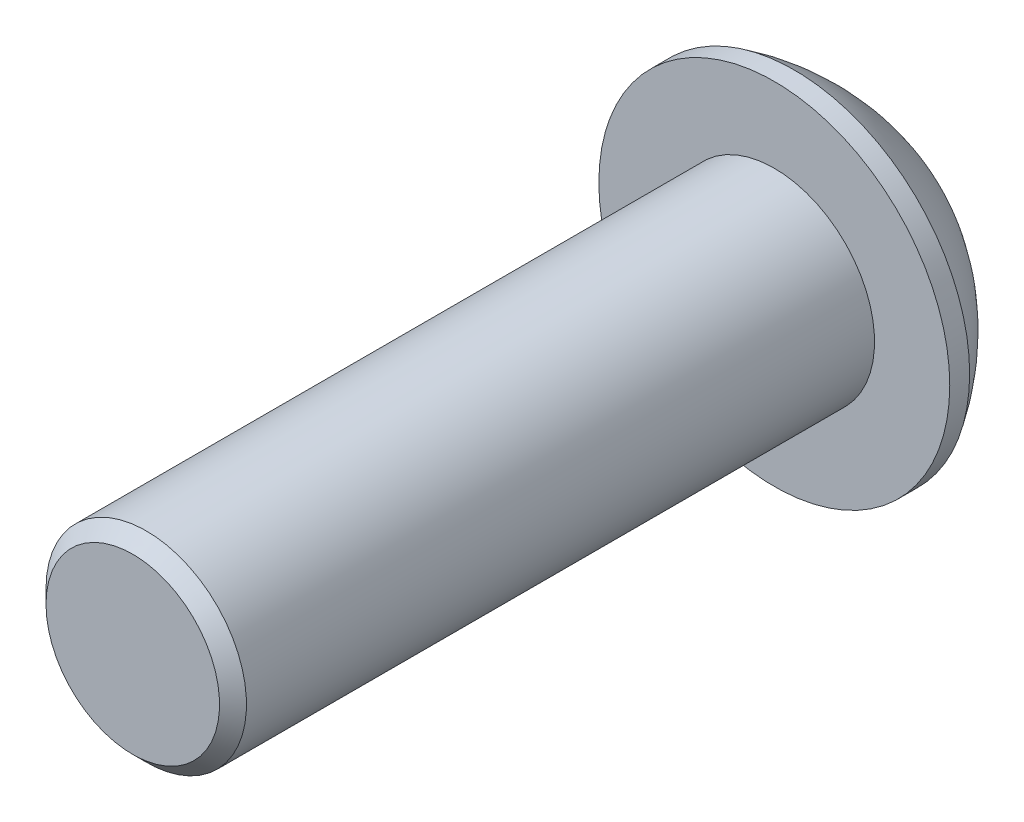
ISO-10303-21;
HEADER;
FILE_DESCRIPTION(('STEP AP214'),'2;1');
FILE_NAME('part.step','',(''),(''),'','','');
FILE_SCHEMA(('AUTOMOTIVE_DESIGN { 1 0 10303 214 1 1 1 1 }'));
ENDSEC;
DATA;
#1=APPLICATION_CONTEXT('core data for automotive mechanical design processes');
#2=APPLICATION_PROTOCOL_DEFINITION('international standard','automotive_design',2000,#1);
#3=PRODUCT_CONTEXT('',#1,'mechanical');
#4=PRODUCT('Part','Part','',(#3));
#5=PRODUCT_RELATED_PRODUCT_CATEGORY('part','',(#4));
#6=PRODUCT_DEFINITION_FORMATION('','',#4);
#7=PRODUCT_DEFINITION_CONTEXT('part definition',#1,'design');
#8=PRODUCT_DEFINITION('design','',#6,#7);
#9=PRODUCT_DEFINITION_SHAPE('','',#8);
#10=(LENGTH_UNIT() NAMED_UNIT(*) SI_UNIT(.MILLI.,.METRE.));
#11=(NAMED_UNIT(*) PLANE_ANGLE_UNIT() SI_UNIT($,.RADIAN.));
#12=(NAMED_UNIT(*) SI_UNIT($,.STERADIAN.) SOLID_ANGLE_UNIT());
#13=UNCERTAINTY_MEASURE_WITH_UNIT(LENGTH_MEASURE(1.E-05),#10,'distance_accuracy_value','');
#14=(GEOMETRIC_REPRESENTATION_CONTEXT(3) GLOBAL_UNCERTAINTY_ASSIGNED_CONTEXT((#13)) GLOBAL_UNIT_ASSIGNED_CONTEXT((#10,
#11,#12)) REPRESENTATION_CONTEXT('',''));
#15=CARTESIAN_POINT('',(0.,0.,0.));
#16=DIRECTION('',(0.,0.,1.));
#17=DIRECTION('',(1.,0.,0.));
#18=AXIS2_PLACEMENT_3D('',#15,#16,#17);
#19=CARTESIAN_POINT('',(3.175,0.,-4.2164));
#20=DIRECTION('',(0.,0.,1.));
#21=DIRECTION('',(1.,0.,0.));
#22=AXIS2_PLACEMENT_3D('',#19,#20,#21);
#23=PLANE('',#22);
#24=DIRECTION('',(0.5,0.866025403784439,0.));
#25=VECTOR('',#24,1.);
#26=CARTESIAN_POINT('',(-2.74963065701559,0.,-4.2164));
#27=LINE('',#26,#25);
#28=CARTESIAN_POINT('',(-2.74963065701559,0.,-4.2164));
#29=VERTEX_POINT('',#28);
#30=CARTESIAN_POINT('',(-1.3748153285078,2.38125,-4.2164));
#31=VERTEX_POINT('',#30);
#32=EDGE_CURVE('E126',#29,#31,#27,.T.);
#33=ORIENTED_EDGE('',*,*,#32,.F.);
#34=DIRECTION('',(-0.5,0.866025403784439,0.));
#35=VECTOR('',#34,1.);
#36=CARTESIAN_POINT('',(-1.3748153285078,-2.38125,-4.2164));
#37=LINE('',#36,#35);
#38=CARTESIAN_POINT('',(-1.3748153285078,-2.38125,-4.2164));
#39=VERTEX_POINT('',#38);
#40=EDGE_CURVE('E52',#39,#29,#37,.T.);
#41=ORIENTED_EDGE('',*,*,#40,.F.);
#42=DIRECTION('',(-1.,0.,0.));
#43=VECTOR('',#42,1.);
#44=CARTESIAN_POINT('',(1.3748153285078,-2.38125,-4.2164));
#45=LINE('',#44,#43);
#46=CARTESIAN_POINT('',(1.3748153285078,-2.38125,-4.2164));
#47=VERTEX_POINT('',#46);
#48=EDGE_CURVE('E135',#47,#39,#45,.T.);
#49=ORIENTED_EDGE('',*,*,#48,.F.);
#50=DIRECTION('',(-0.5,-0.866025403784439,0.));
#51=VECTOR('',#50,1.);
#52=CARTESIAN_POINT('',(2.74963065701559,0.,-4.2164));
#53=LINE('',#52,#51);
#54=CARTESIAN_POINT('',(2.74963065701559,0.,-4.2164));
#55=VERTEX_POINT('',#54);
#56=EDGE_CURVE('E133',#55,#47,#53,.T.);
#57=ORIENTED_EDGE('',*,*,#56,.F.);
#58=DIRECTION('',(0.5,-0.866025403784439,0.));
#59=VECTOR('',#58,1.);
#60=CARTESIAN_POINT('',(1.3748153285078,2.38125,-4.2164));
#61=LINE('',#60,#59);
#62=CARTESIAN_POINT('',(1.3748153285078,2.38125,-4.2164));
#63=VERTEX_POINT('',#62);
#64=EDGE_CURVE('E100',#63,#55,#61,.T.);
#65=ORIENTED_EDGE('',*,*,#64,.F.);
#66=DIRECTION('',(1.,0.,0.));
#67=VECTOR('',#66,1.);
#68=CARTESIAN_POINT('',(-1.3748153285078,2.38125,-4.2164));
#69=LINE('',#68,#67);
#70=EDGE_CURVE('E129',#31,#63,#69,.T.);
#71=ORIENTED_EDGE('',*,*,#70,.F.);
#72=EDGE_LOOP('',(#33,#41,#49,#57,#65,#71));
#73=FACE_BOUND('',#72,.T.);
#74=CARTESIAN_POINT('',(0.,0.,-4.2164));
#75=DIRECTION('',(0.,0.,-1.));
#76=DIRECTION('',(-1.,0.,0.));
#77=AXIS2_PLACEMENT_3D('',#74,#75,#76);
#78=CIRCLE('',#77,3.175);
#79=CARTESIAN_POINT('',(-3.175,0.,-4.2164));
#80=VERTEX_POINT('',#79);
#81=EDGE_CURVE('E139',#80,#80,#78,.T.);
#82=ORIENTED_EDGE('',*,*,#81,.T.);
#83=EDGE_LOOP('',(#82));
#84=FACE_BOUND('',#83,.T.);
#85=ADVANCED_FACE('F36',(#73,#84),#23,.F.);
#86=CARTESIAN_POINT('',(0.,0.,25.4));
#87=DIRECTION('',(0.,0.,-1.));
#88=DIRECTION('',(-1.,0.,0.));
#89=AXIS2_PLACEMENT_3D('',#86,#87,#88);
#90=PLANE('',#89);
#91=CARTESIAN_POINT('',(0.,0.,25.4));
#92=DIRECTION('',(0.,0.,-1.));
#93=DIRECTION('',(-1.,0.,0.));
#94=AXIS2_PLACEMENT_3D('',#91,#92,#93);
#95=CIRCLE('',#94,3.43535);
#96=CARTESIAN_POINT('',(-3.43534999999999,0.,25.4));
#97=VERTEX_POINT('',#96);
#98=EDGE_CURVE('E11',#97,#97,#95,.F.);
#99=ORIENTED_EDGE('',*,*,#98,.T.);
#100=EDGE_LOOP('',(#99));
#101=FACE_BOUND('',#100,.T.);
#102=ADVANCED_FACE('F172',(#101),#90,.F.);
#103=CARTESIAN_POINT('',(0.,0.,0.));
#104=DIRECTION('',(0.,0.,-1.));
#105=DIRECTION('',(-1.,0.,0.));
#106=AXIS2_PLACEMENT_3D('',#103,#104,#105);
#107=CYLINDRICAL_SURFACE('',#106,3.96875);
#108=CARTESIAN_POINT('',(0.,0.,24.8666));
#109=DIRECTION('',(0.,0.,-1.));
#110=DIRECTION('',(-1.,0.,0.));
#111=AXIS2_PLACEMENT_3D('',#108,#109,#110);
#112=CIRCLE('',#111,3.96875);
#113=CARTESIAN_POINT('',(-3.96875,0.,24.8666));
#114=VERTEX_POINT('',#113);
#115=EDGE_CURVE('E45',#114,#114,#112,.T.);
#116=ORIENTED_EDGE('',*,*,#115,.T.);
#117=EDGE_LOOP('',(#116));
#118=FACE_BOUND('',#117,.T.);
#119=CARTESIAN_POINT('',(0.,0.,0.));
#120=DIRECTION('',(0.,0.,-1.));
#121=DIRECTION('',(-1.,0.,0.));
#122=AXIS2_PLACEMENT_3D('',#119,#120,#121);
#123=CIRCLE('',#122,3.96875);
#124=CARTESIAN_POINT('',(-3.96875,0.,0.));
#125=VERTEX_POINT('',#124);
#126=EDGE_CURVE('E153',#125,#125,#123,.T.);
#127=ORIENTED_EDGE('',*,*,#126,.F.);
#128=EDGE_LOOP('',(#127));
#129=FACE_BOUND('',#128,.T.);
#130=ADVANCED_FACE('F160',(#118,#129),#107,.T.);
#131=CARTESIAN_POINT('',(3.96875,0.,0.));
#132=DIRECTION('',(0.,0.,-1.));
#133=DIRECTION('',(-1.,0.,0.));
#134=AXIS2_PLACEMENT_3D('',#131,#132,#133);
#135=PLANE('',#134);
#136=CARTESIAN_POINT('',(0.,0.,0.));
#137=DIRECTION('',(0.,0.,-1.));
#138=DIRECTION('',(-1.,0.,0.));
#139=AXIS2_PLACEMENT_3D('',#136,#137,#138);
#140=CIRCLE('',#139,6.9469);
#141=CARTESIAN_POINT('',(-6.9469,0.,0.));
#142=VERTEX_POINT('',#141);
#143=EDGE_CURVE('E150',#142,#142,#140,.T.);
#144=ORIENTED_EDGE('',*,*,#143,.F.);
#145=EDGE_LOOP('',(#144));
#146=FACE_BOUND('',#145,.T.);
#147=ORIENTED_EDGE('',*,*,#126,.T.);
#148=EDGE_LOOP('',(#147));
#149=FACE_BOUND('',#148,.T.);
#150=ADVANCED_FACE('F184',(#146,#149),#135,.F.);
#151=CARTESIAN_POINT('',(0.,0.,0.));
#152=DIRECTION('',(0.,0.,-1.));
#153=DIRECTION('',(-1.,0.,0.));
#154=AXIS2_PLACEMENT_3D('',#151,#152,#153);
#155=CYLINDRICAL_SURFACE('',#154,6.9469);
#156=CARTESIAN_POINT('',(0.,0.,-0.787399999999999));
#157=DIRECTION('',(0.,0.,-1.));
#158=DIRECTION('',(-1.,0.,0.));
#159=AXIS2_PLACEMENT_3D('',#156,#157,#158);
#160=CIRCLE('',#159,6.9469);
#161=CARTESIAN_POINT('',(-6.9469,0.,-0.787399999999998));
#162=VERTEX_POINT('',#161);
#163=EDGE_CURVE('E147',#162,#162,#160,.T.);
#164=ORIENTED_EDGE('',*,*,#163,.F.);
#165=EDGE_LOOP('',(#164));
#166=FACE_BOUND('',#165,.T.);
#167=ORIENTED_EDGE('',*,*,#143,.T.);
#168=EDGE_LOOP('',(#167));
#169=FACE_BOUND('',#168,.T.);
#170=ADVANCED_FACE('F187',(#166,#169),#155,.T.);
#171=CARTESIAN_POINT('',(0.,0.,4.28901294252659));
#172=DIRECTION('',(0.,0.,-1.));
#173=DIRECTION('',(-1.,0.,0.));
#174=AXIS2_PLACEMENT_3D('',#171,#172,#173);
#175=DEGENERATE_TOROIDAL_SURFACE('',#174,1.11260722047872,9.525,.F.);
#176=ORIENTED_EDGE('',*,*,#81,.F.);
#177=EDGE_LOOP('',(#176));
#178=FACE_BOUND('',#177,.T.);
#179=ORIENTED_EDGE('',*,*,#163,.T.);
#180=EDGE_LOOP('',(#179));
#181=FACE_BOUND('',#180,.T.);
#182=ADVANCED_FACE('F191',(#178,#181),#175,.F.);
#183=CARTESIAN_POINT('',(-1.3748153285078,-2.38125,-1.0414));
#184=DIRECTION('',(-0.866025403784439,-0.5,0.));
#185=DIRECTION('',(0.5,-0.866025403784439,0.));
#186=AXIS2_PLACEMENT_3D('',#183,#184,#185);
#187=PLANE('',#186);
#188=ORIENTED_EDGE('',*,*,#40,.T.);
#189=DIRECTION('',(0.,0.,-1.));
#190=VECTOR('',#189,1.);
#191=CARTESIAN_POINT('',(-2.74963065701559,0.,-1.0414));
#192=LINE('',#191,#190);
#193=CARTESIAN_POINT('',(-2.74963065701559,0.,-1.0414));
#194=VERTEX_POINT('',#193);
#195=EDGE_CURVE('E82',#194,#29,#192,.T.);
#196=ORIENTED_EDGE('',*,*,#195,.F.);
#197=DIRECTION('',(-0.5,0.866025403784439,0.));
#198=VECTOR('',#197,1.);
#199=CARTESIAN_POINT('',(-1.3748153285078,-2.38125,-1.0414));
#200=LINE('',#199,#198);
#201=CARTESIAN_POINT('',(-1.3748153285078,-2.38125,-1.0414));
#202=VERTEX_POINT('',#201);
#203=EDGE_CURVE('E137',#202,#194,#200,.T.);
#204=ORIENTED_EDGE('',*,*,#203,.F.);
#205=DIRECTION('',(0.,0.,-1.));
#206=VECTOR('',#205,1.);
#207=CARTESIAN_POINT('',(-1.3748153285078,-2.38125,-1.0414));
#208=LINE('',#207,#206);
#209=EDGE_CURVE('E60',#202,#39,#208,.T.);
#210=ORIENTED_EDGE('',*,*,#209,.T.);
#211=EDGE_LOOP('',(#188,#196,#204,#210));
#212=FACE_BOUND('',#211,.T.);
#213=ADVANCED_FACE('F195',(#212),#187,.F.);
#214=CARTESIAN_POINT('',(1.3748153285078,-2.38125,-1.0414));
#215=DIRECTION('',(0.,-1.,0.));
#216=DIRECTION('',(0.,0.,-1.));
#217=AXIS2_PLACEMENT_3D('',#214,#215,#216);
#218=PLANE('',#217);
#219=ORIENTED_EDGE('',*,*,#48,.T.);
#220=ORIENTED_EDGE('',*,*,#209,.F.);
#221=DIRECTION('',(-1.,0.,0.));
#222=VECTOR('',#221,1.);
#223=CARTESIAN_POINT('',(1.3748153285078,-2.38125,-1.0414));
#224=LINE('',#223,#222);
#225=CARTESIAN_POINT('',(1.3748153285078,-2.38125,-1.0414));
#226=VERTEX_POINT('',#225);
#227=EDGE_CURVE('E112',#226,#202,#224,.T.);
#228=ORIENTED_EDGE('',*,*,#227,.F.);
#229=DIRECTION('',(0.,0.,-1.));
#230=VECTOR('',#229,1.);
#231=CARTESIAN_POINT('',(1.3748153285078,-2.38125,-1.0414));
#232=LINE('',#231,#230);
#233=EDGE_CURVE('E104',#226,#47,#232,.T.);
#234=ORIENTED_EDGE('',*,*,#233,.T.);
#235=EDGE_LOOP('',(#219,#220,#228,#234));
#236=FACE_BOUND('',#235,.T.);
#237=ADVANCED_FACE('F199',(#236),#218,.F.);
#238=CARTESIAN_POINT('',(2.74963065701559,0.,-1.0414));
#239=DIRECTION('',(0.866025403784439,-0.5,0.));
#240=DIRECTION('',(0.5,0.866025403784439,0.));
#241=AXIS2_PLACEMENT_3D('',#238,#239,#240);
#242=PLANE('',#241);
#243=ORIENTED_EDGE('',*,*,#56,.T.);
#244=ORIENTED_EDGE('',*,*,#233,.F.);
#245=DIRECTION('',(-0.5,-0.866025403784439,0.));
#246=VECTOR('',#245,1.);
#247=CARTESIAN_POINT('',(2.74963065701559,0.,-1.0414));
#248=LINE('',#247,#246);
#249=CARTESIAN_POINT('',(2.74963065701559,0.,-1.0414));
#250=VERTEX_POINT('',#249);
#251=EDGE_CURVE('E108',#250,#226,#248,.T.);
#252=ORIENTED_EDGE('',*,*,#251,.F.);
#253=DIRECTION('',(0.,0.,-1.));
#254=VECTOR('',#253,1.);
#255=CARTESIAN_POINT('',(2.74963065701559,0.,-1.0414));
#256=LINE('',#255,#254);
#257=EDGE_CURVE('E93',#250,#55,#256,.T.);
#258=ORIENTED_EDGE('',*,*,#257,.T.);
#259=EDGE_LOOP('',(#243,#244,#252,#258));
#260=FACE_BOUND('',#259,.T.);
#261=ADVANCED_FACE('F109',(#260),#242,.F.);
#262=CARTESIAN_POINT('',(1.3748153285078,2.38125,-1.0414));
#263=DIRECTION('',(0.866025403784439,0.5,0.));
#264=DIRECTION('',(-0.5,0.866025403784439,0.));
#265=AXIS2_PLACEMENT_3D('',#262,#263,#264);
#266=PLANE('',#265);
#267=ORIENTED_EDGE('',*,*,#64,.T.);
#268=ORIENTED_EDGE('',*,*,#257,.F.);
#269=DIRECTION('',(0.5,-0.866025403784439,0.));
#270=VECTOR('',#269,1.);
#271=CARTESIAN_POINT('',(1.3748153285078,2.38125,-1.0414));
#272=LINE('',#271,#270);
#273=CARTESIAN_POINT('',(1.3748153285078,2.38125,-1.0414));
#274=VERTEX_POINT('',#273);
#275=EDGE_CURVE('E97',#274,#250,#272,.T.);
#276=ORIENTED_EDGE('',*,*,#275,.F.);
#277=DIRECTION('',(0.,0.,-1.));
#278=VECTOR('',#277,1.);
#279=CARTESIAN_POINT('',(1.3748153285078,2.38125,-1.0414));
#280=LINE('',#279,#278);
#281=EDGE_CURVE('E105',#274,#63,#280,.T.);
#282=ORIENTED_EDGE('',*,*,#281,.T.);
#283=EDGE_LOOP('',(#267,#268,#276,#282));
#284=FACE_BOUND('',#283,.T.);
#285=ADVANCED_FACE('F95',(#284),#266,.F.);
#286=CARTESIAN_POINT('',(-1.3748153285078,2.38125,-1.0414));
#287=DIRECTION('',(0.,1.,0.));
#288=DIRECTION('',(-1.,0.,0.));
#289=AXIS2_PLACEMENT_3D('',#286,#287,#288);
#290=PLANE('',#289);
#291=ORIENTED_EDGE('',*,*,#70,.T.);
#292=ORIENTED_EDGE('',*,*,#281,.F.);
#293=DIRECTION('',(1.,0.,0.));
#294=VECTOR('',#293,1.);
#295=CARTESIAN_POINT('',(-1.3748153285078,2.38125,-1.0414));
#296=LINE('',#295,#294);
#297=CARTESIAN_POINT('',(-1.3748153285078,2.38125,-1.0414));
#298=VERTEX_POINT('',#297);
#299=EDGE_CURVE('E118',#298,#274,#296,.T.);
#300=ORIENTED_EDGE('',*,*,#299,.F.);
#301=DIRECTION('',(0.,0.,-1.));
#302=VECTOR('',#301,1.);
#303=CARTESIAN_POINT('',(-1.3748153285078,2.38125,-1.0414));
#304=LINE('',#303,#302);
#305=EDGE_CURVE('E142',#298,#31,#304,.T.);
#306=ORIENTED_EDGE('',*,*,#305,.T.);
#307=EDGE_LOOP('',(#291,#292,#300,#306));
#308=FACE_BOUND('',#307,.T.);
#309=ADVANCED_FACE('F202',(#308),#290,.F.);
#310=CARTESIAN_POINT('',(-2.74963065701559,0.,-1.0414));
#311=DIRECTION('',(-0.866025403784439,0.5,0.));
#312=DIRECTION('',(-0.5,-0.866025403784439,0.));
#313=AXIS2_PLACEMENT_3D('',#310,#311,#312);
#314=PLANE('',#313);
#315=ORIENTED_EDGE('',*,*,#32,.T.);
#316=ORIENTED_EDGE('',*,*,#305,.F.);
#317=DIRECTION('',(0.5,0.866025403784439,0.));
#318=VECTOR('',#317,1.);
#319=CARTESIAN_POINT('',(-2.74963065701559,0.,-1.0414));
#320=LINE('',#319,#318);
#321=EDGE_CURVE('E120',#194,#298,#320,.T.);
#322=ORIENTED_EDGE('',*,*,#321,.F.);
#323=ORIENTED_EDGE('',*,*,#195,.T.);
#324=EDGE_LOOP('',(#315,#316,#322,#323));
#325=FACE_BOUND('',#324,.T.);
#326=ADVANCED_FACE('F168',(#325),#314,.F.);
#327=CARTESIAN_POINT('',(-1.3748153285078,-2.38125,-1.0414));
#328=DIRECTION('',(0.,0.,1.));
#329=DIRECTION('',(1.,0.,0.));
#330=AXIS2_PLACEMENT_3D('',#327,#328,#329);
#331=PLANE('',#330);
#332=ORIENTED_EDGE('',*,*,#203,.T.);
#333=ORIENTED_EDGE('',*,*,#321,.T.);
#334=ORIENTED_EDGE('',*,*,#299,.T.);
#335=ORIENTED_EDGE('',*,*,#275,.T.);
#336=ORIENTED_EDGE('',*,*,#251,.T.);
#337=ORIENTED_EDGE('',*,*,#227,.T.);
#338=EDGE_LOOP('',(#332,#333,#334,#335,#336,#337));
#339=FACE_BOUND('',#338,.T.);
#340=ADVANCED_FACE('F115',(#339),#331,.F.);
#341=CARTESIAN_POINT('',(0.,0.,24.8666));
#342=DIRECTION('',(0.,0.,-1.));
#343=DIRECTION('',(-1.,0.,0.));
#344=AXIS2_PLACEMENT_3D('',#341,#342,#343);
#345=CONICAL_SURFACE('',#344,3.96875,0.785398163397451);
#346=ORIENTED_EDGE('',*,*,#98,.F.);
#347=EDGE_LOOP('',(#346));
#348=FACE_BOUND('',#347,.T.);
#349=ORIENTED_EDGE('',*,*,#115,.F.);
#350=EDGE_LOOP('',(#349));
#351=FACE_BOUND('',#350,.T.);
#352=ADVANCED_FACE('F38',(#348,#351),#345,.T.);
#353=CLOSED_SHELL('',(#85,#102,#130,#150,#170,#182,#213,#237,#261,#285,#309,#326,#340,#352));
#354=MANIFOLD_SOLID_BREP('B2',#353);
#355=ADVANCED_BREP_SHAPE_REPRESENTATION('',(#18,#354),#14);
#356=SHAPE_DEFINITION_REPRESENTATION(#9,#355);
ENDSEC;
END-ISO-10303-21;
